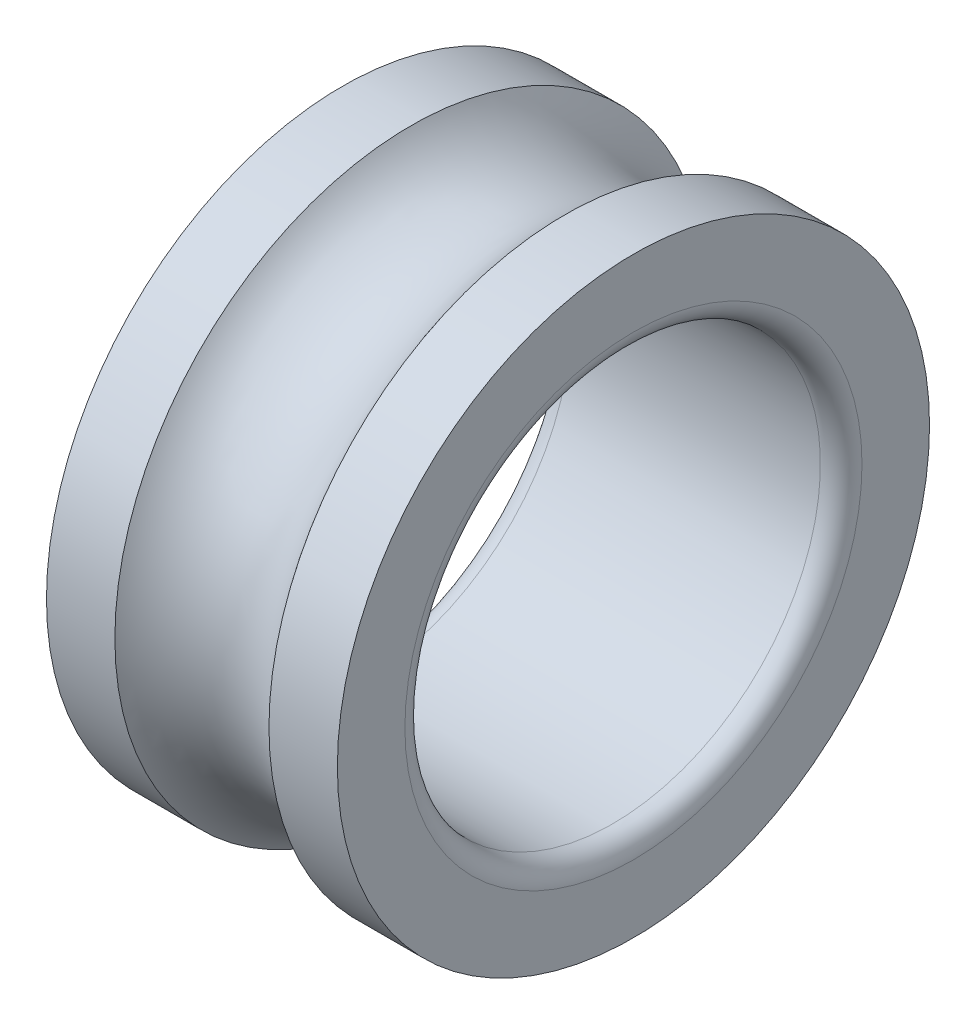
ISO-10303-21;
HEADER;
FILE_DESCRIPTION(('STEP AP214'),'2;1');
FILE_NAME('part.step','',(''),(''),'','','');
FILE_SCHEMA(('AUTOMOTIVE_DESIGN { 1 0 10303 214 1 1 1 1 }'));
ENDSEC;
DATA;
#1=APPLICATION_CONTEXT('core data for automotive mechanical design processes');
#2=APPLICATION_PROTOCOL_DEFINITION('international standard','automotive_design',2000,#1);
#3=PRODUCT_CONTEXT('',#1,'mechanical');
#4=PRODUCT('Part','Part','',(#3));
#5=PRODUCT_RELATED_PRODUCT_CATEGORY('part','',(#4));
#6=PRODUCT_DEFINITION_FORMATION('','',#4);
#7=PRODUCT_DEFINITION_CONTEXT('part definition',#1,'design');
#8=PRODUCT_DEFINITION('design','',#6,#7);
#9=PRODUCT_DEFINITION_SHAPE('','',#8);
#10=(LENGTH_UNIT() NAMED_UNIT(*) SI_UNIT(.MILLI.,.METRE.));
#11=(NAMED_UNIT(*) PLANE_ANGLE_UNIT() SI_UNIT($,.RADIAN.));
#12=(NAMED_UNIT(*) SI_UNIT($,.STERADIAN.) SOLID_ANGLE_UNIT());
#13=UNCERTAINTY_MEASURE_WITH_UNIT(LENGTH_MEASURE(1.E-05),#10,'distance_accuracy_value','');
#14=(GEOMETRIC_REPRESENTATION_CONTEXT(3) GLOBAL_UNCERTAINTY_ASSIGNED_CONTEXT((#13)) GLOBAL_UNIT_ASSIGNED_CONTEXT((#10,
#11,#12)) REPRESENTATION_CONTEXT('',''));
#15=CARTESIAN_POINT('',(0.,0.,0.));
#16=DIRECTION('',(0.,0.,1.));
#17=DIRECTION('',(1.,0.,0.));
#18=AXIS2_PLACEMENT_3D('',#15,#16,#17);
#19=CARTESIAN_POINT('',(0.,0.,0.));
#20=DIRECTION('',(-1.,0.,0.));
#21=DIRECTION('',(0.,0.,1.));
#22=AXIS2_PLACEMENT_3D('',#19,#20,#21);
#23=CYLINDRICAL_SURFACE('',#22,14.25);
#24=CARTESIAN_POINT('',(0.,0.,0.));
#25=DIRECTION('',(-1.,0.,0.));
#26=DIRECTION('',(0.,0.,1.));
#27=AXIS2_PLACEMENT_3D('',#24,#25,#26);
#28=CIRCLE('',#27,14.25);
#29=CARTESIAN_POINT('',(0.,0.,14.25));
#30=VERTEX_POINT('',#29);
#31=EDGE_CURVE('E10',#30,#30,#28,.T.);
#32=ORIENTED_EDGE('',*,*,#31,.F.);
#33=EDGE_LOOP('',(#32));
#34=FACE_BOUND('',#33,.T.);
#35=CARTESIAN_POINT('',(3.29223787170752,0.,0.));
#36=DIRECTION('',(-1.,0.,0.));
#37=DIRECTION('',(0.,0.,1.));
#38=AXIS2_PLACEMENT_3D('',#35,#36,#37);
#39=CIRCLE('',#38,14.25);
#40=CARTESIAN_POINT('',(3.29223787170752,0.,14.25));
#41=VERTEX_POINT('',#40);
#42=EDGE_CURVE('E43',#41,#41,#39,.T.);
#43=ORIENTED_EDGE('',*,*,#42,.T.);
#44=EDGE_LOOP('',(#43));
#45=FACE_BOUND('',#44,.T.);
#46=ADVANCED_FACE('F15',(#34,#45),#23,.T.);
#47=CARTESIAN_POINT('',(0.,14.25,0.));
#48=DIRECTION('',(1.,0.,0.));
#49=DIRECTION('',(0.,0.,-1.));
#50=AXIS2_PLACEMENT_3D('',#47,#48,#49);
#51=PLANE('',#50);
#52=CARTESIAN_POINT('',(0.,0.,0.));
#53=DIRECTION('',(-1.,0.,0.));
#54=DIRECTION('',(0.,0.,1.));
#55=AXIS2_PLACEMENT_3D('',#52,#53,#54);
#56=CIRCLE('',#55,11.);
#57=CARTESIAN_POINT('',(0.,0.,11.));
#58=VERTEX_POINT('',#57);
#59=EDGE_CURVE('E21',#58,#58,#56,.T.);
#60=ORIENTED_EDGE('',*,*,#59,.F.);
#61=EDGE_LOOP('',(#60));
#62=FACE_BOUND('',#61,.T.);
#63=ORIENTED_EDGE('',*,*,#31,.T.);
#64=EDGE_LOOP('',(#63));
#65=FACE_BOUND('',#64,.T.);
#66=ADVANCED_FACE('F61',(#62,#65),#51,.F.);
#67=CARTESIAN_POINT('',(1.,0.,0.));
#68=DIRECTION('',(-1.,0.,0.));
#69=DIRECTION('',(0.,0.,1.));
#70=AXIS2_PLACEMENT_3D('',#67,#68,#69);
#71=TOROIDAL_SURFACE('',#70,11.,1.);
#72=CARTESIAN_POINT('',(1.,0.,0.));
#73=DIRECTION('',(-1.,0.,0.));
#74=DIRECTION('',(0.,0.,1.));
#75=AXIS2_PLACEMENT_3D('',#72,#73,#74);
#76=CIRCLE('',#75,10.);
#77=CARTESIAN_POINT('',(1.,0.,10.));
#78=VERTEX_POINT('',#77);
#79=EDGE_CURVE('E25',#78,#78,#76,.T.);
#80=ORIENTED_EDGE('',*,*,#79,.F.);
#81=EDGE_LOOP('',(#80));
#82=FACE_BOUND('',#81,.T.);
#83=ORIENTED_EDGE('',*,*,#59,.T.);
#84=EDGE_LOOP('',(#83));
#85=FACE_BOUND('',#84,.T.);
#86=ADVANCED_FACE('F66',(#82,#85),#71,.T.);
#87=CARTESIAN_POINT('',(0.,0.,0.));
#88=DIRECTION('',(-1.,0.,0.));
#89=DIRECTION('',(0.,0.,1.));
#90=AXIS2_PLACEMENT_3D('',#87,#88,#89);
#91=CYLINDRICAL_SURFACE('',#90,10.);
#92=CARTESIAN_POINT('',(13.,0.,0.));
#93=DIRECTION('',(-1.,0.,0.));
#94=DIRECTION('',(0.,0.,1.));
#95=AXIS2_PLACEMENT_3D('',#92,#93,#94);
#96=CIRCLE('',#95,10.);
#97=CARTESIAN_POINT('',(13.,0.,10.));
#98=VERTEX_POINT('',#97);
#99=EDGE_CURVE('E29',#98,#98,#96,.T.);
#100=ORIENTED_EDGE('',*,*,#99,.F.);
#101=EDGE_LOOP('',(#100));
#102=FACE_BOUND('',#101,.T.);
#103=ORIENTED_EDGE('',*,*,#79,.T.);
#104=EDGE_LOOP('',(#103));
#105=FACE_BOUND('',#104,.T.);
#106=ADVANCED_FACE('F71',(#102,#105),#91,.F.);
#107=CARTESIAN_POINT('',(13.,0.,0.));
#108=DIRECTION('',(-1.,0.,0.));
#109=DIRECTION('',(0.,0.,1.));
#110=AXIS2_PLACEMENT_3D('',#107,#108,#109);
#111=TOROIDAL_SURFACE('',#110,11.,1.);
#112=CARTESIAN_POINT('',(14.,0.,0.));
#113=DIRECTION('',(-1.,0.,0.));
#114=DIRECTION('',(0.,0.,1.));
#115=AXIS2_PLACEMENT_3D('',#112,#113,#114);
#116=CIRCLE('',#115,11.);
#117=CARTESIAN_POINT('',(14.,0.,11.));
#118=VERTEX_POINT('',#117);
#119=EDGE_CURVE('E34',#118,#118,#116,.T.);
#120=ORIENTED_EDGE('',*,*,#119,.F.);
#121=EDGE_LOOP('',(#120));
#122=FACE_BOUND('',#121,.T.);
#123=ORIENTED_EDGE('',*,*,#99,.T.);
#124=EDGE_LOOP('',(#123));
#125=FACE_BOUND('',#124,.T.);
#126=ADVANCED_FACE('F77',(#122,#125),#111,.T.);
#127=CARTESIAN_POINT('',(14.,11.,0.));
#128=DIRECTION('',(-1.,0.,0.));
#129=DIRECTION('',(0.,0.,1.));
#130=AXIS2_PLACEMENT_3D('',#127,#128,#129);
#131=PLANE('',#130);
#132=CARTESIAN_POINT('',(14.,0.,0.));
#133=DIRECTION('',(-1.,0.,0.));
#134=DIRECTION('',(0.,0.,1.));
#135=AXIS2_PLACEMENT_3D('',#132,#133,#134);
#136=CIRCLE('',#135,14.25);
#137=CARTESIAN_POINT('',(14.,0.,14.25));
#138=VERTEX_POINT('',#137);
#139=EDGE_CURVE('E37',#138,#138,#136,.T.);
#140=ORIENTED_EDGE('',*,*,#139,.F.);
#141=EDGE_LOOP('',(#140));
#142=FACE_BOUND('',#141,.T.);
#143=ORIENTED_EDGE('',*,*,#119,.T.);
#144=EDGE_LOOP('',(#143));
#145=FACE_BOUND('',#144,.T.);
#146=ADVANCED_FACE('F57',(#142,#145),#131,.F.);
#147=CARTESIAN_POINT('',(0.,0.,0.));
#148=DIRECTION('',(-1.,0.,0.));
#149=DIRECTION('',(0.,0.,1.));
#150=AXIS2_PLACEMENT_3D('',#147,#148,#149);
#151=CYLINDRICAL_SURFACE('',#150,14.25);
#152=CARTESIAN_POINT('',(10.7077621282925,0.,0.));
#153=DIRECTION('',(-1.,0.,0.));
#154=DIRECTION('',(0.,0.,1.));
#155=AXIS2_PLACEMENT_3D('',#152,#153,#154);
#156=CIRCLE('',#155,14.25);
#157=CARTESIAN_POINT('',(10.7077621282925,0.,14.25));
#158=VERTEX_POINT('',#157);
#159=EDGE_CURVE('E40',#158,#158,#156,.T.);
#160=ORIENTED_EDGE('',*,*,#159,.F.);
#161=EDGE_LOOP('',(#160));
#162=FACE_BOUND('',#161,.T.);
#163=ORIENTED_EDGE('',*,*,#139,.T.);
#164=EDGE_LOOP('',(#163));
#165=FACE_BOUND('',#164,.T.);
#166=ADVANCED_FACE('F50',(#162,#165),#151,.T.);
#167=CARTESIAN_POINT('',(7.,0.,0.));
#168=DIRECTION('',(-1.,0.,0.));
#169=DIRECTION('',(0.,0.,1.));
#170=AXIS2_PLACEMENT_3D('',#167,#168,#169);
#171=TOROIDAL_SURFACE('',#170,16.8,4.5);
#172=ORIENTED_EDGE('',*,*,#159,.T.);
#173=EDGE_LOOP('',(#172));
#174=FACE_BOUND('',#173,.T.);
#175=ORIENTED_EDGE('',*,*,#42,.F.);
#176=EDGE_LOOP('',(#175));
#177=FACE_BOUND('',#176,.T.);
#178=ADVANCED_FACE('F48',(#174,#177),#171,.F.);
#179=CLOSED_SHELL('',(#46,#66,#86,#106,#126,#146,#166,#178));
#180=MANIFOLD_SOLID_BREP('B1',#179);
#181=ADVANCED_BREP_SHAPE_REPRESENTATION('',(#18,#180),#14);
#182=SHAPE_DEFINITION_REPRESENTATION(#9,#181);
ENDSEC;
END-ISO-10303-21;
